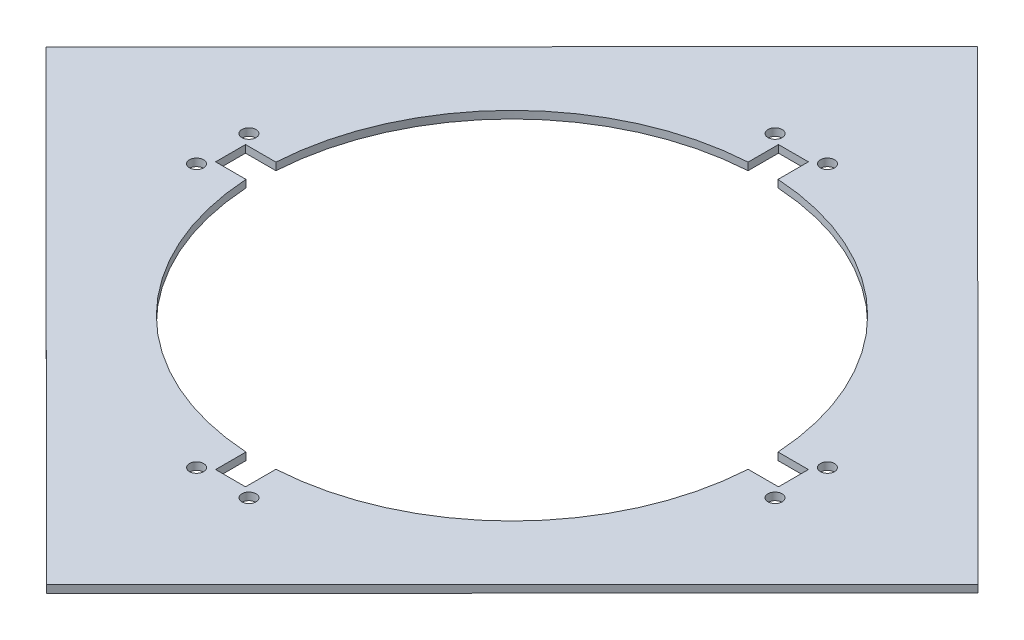
ISO-10303-21;
HEADER;
FILE_DESCRIPTION(('STEP AP214'),'2;1');
FILE_NAME('part.step','',(''),(''),'','','');
FILE_SCHEMA(('AUTOMOTIVE_DESIGN { 1 0 10303 214 1 1 1 1 }'));
ENDSEC;
DATA;
#1=APPLICATION_CONTEXT('core data for automotive mechanical design processes');
#2=APPLICATION_PROTOCOL_DEFINITION('international standard','automotive_design',2000,#1);
#3=PRODUCT_CONTEXT('',#1,'mechanical');
#4=PRODUCT('Part','Part','',(#3));
#5=PRODUCT_RELATED_PRODUCT_CATEGORY('part','',(#4));
#6=PRODUCT_DEFINITION_FORMATION('','',#4);
#7=PRODUCT_DEFINITION_CONTEXT('part definition',#1,'design');
#8=PRODUCT_DEFINITION('design','',#6,#7);
#9=PRODUCT_DEFINITION_SHAPE('','',#8);
#10=(LENGTH_UNIT() NAMED_UNIT(*) SI_UNIT(.MILLI.,.METRE.));
#11=(NAMED_UNIT(*) PLANE_ANGLE_UNIT() SI_UNIT($,.RADIAN.));
#12=(NAMED_UNIT(*) SI_UNIT($,.STERADIAN.) SOLID_ANGLE_UNIT());
#13=UNCERTAINTY_MEASURE_WITH_UNIT(LENGTH_MEASURE(1.E-05),#10,'distance_accuracy_value','');
#14=(GEOMETRIC_REPRESENTATION_CONTEXT(3) GLOBAL_UNCERTAINTY_ASSIGNED_CONTEXT((#13)) GLOBAL_UNIT_ASSIGNED_CONTEXT((#10,
#11,#12)) REPRESENTATION_CONTEXT('',''));
#15=CARTESIAN_POINT('',(0.,0.,0.));
#16=DIRECTION('',(0.,0.,1.));
#17=DIRECTION('',(1.,0.,0.));
#18=AXIS2_PLACEMENT_3D('',#15,#16,#17);
#19=CARTESIAN_POINT('',(0.,1.5875,0.));
#20=DIRECTION('',(0.,-1.,0.));
#21=DIRECTION('',(0.,0.,-1.));
#22=AXIS2_PLACEMENT_3D('',#19,#20,#21);
#23=CYLINDRICAL_SURFACE('',#22,53.34);
#24=DIRECTION('',(0.,-1.,0.));
#25=VECTOR('',#24,1.);
#26=CARTESIAN_POINT('',(-3.175,1.5875,-53.2454221036889));
#27=LINE('',#26,#25);
#28=CARTESIAN_POINT('',(-3.175,1.5875,-53.2454221036889));
#29=VERTEX_POINT('',#28);
#30=CARTESIAN_POINT('',(-3.175,0.,-53.2454221036889));
#31=VERTEX_POINT('',#30);
#32=EDGE_CURVE('E184',#29,#31,#27,.T.);
#33=ORIENTED_EDGE('',*,*,#32,.F.);
#34=CARTESIAN_POINT('',(0.,1.5875,0.));
#35=DIRECTION('',(0.,1.,0.));
#36=DIRECTION('',(0.,0.,1.));
#37=AXIS2_PLACEMENT_3D('',#34,#35,#36);
#38=CIRCLE('',#37,53.34);
#39=CARTESIAN_POINT('',(-53.245422103689,1.5875,-3.17499999999861));
#40=VERTEX_POINT('',#39);
#41=EDGE_CURVE('E698',#29,#40,#38,.T.);
#42=ORIENTED_EDGE('',*,*,#41,.T.);
#43=DIRECTION('',(0.,-1.,0.));
#44=VECTOR('',#43,1.);
#45=CARTESIAN_POINT('',(-53.245422103689,1.5875,-3.17499999999861));
#46=LINE('',#45,#44);
#47=CARTESIAN_POINT('',(-53.245422103689,0.,-3.17499999999861));
#48=VERTEX_POINT('',#47);
#49=EDGE_CURVE('E177',#48,#40,#46,.F.);
#50=ORIENTED_EDGE('',*,*,#49,.F.);
#51=CARTESIAN_POINT('',(0.,0.,0.));
#52=DIRECTION('',(0.,1.,0.));
#53=DIRECTION('',(0.,0.,1.));
#54=AXIS2_PLACEMENT_3D('',#51,#52,#53);
#55=CIRCLE('',#54,53.34);
#56=EDGE_CURVE('E387',#31,#48,#55,.T.);
#57=ORIENTED_EDGE('',*,*,#56,.F.);
#58=EDGE_LOOP('',(#33,#42,#50,#57));
#59=FACE_BOUND('',#58,.T.);
#60=ADVANCED_FACE('F33',(#59),#23,.F.);
#61=DIRECTION('',(0.,-1.,0.));
#62=VECTOR('',#61,1.);
#63=CARTESIAN_POINT('',(3.175,1.5875,-53.2454221036889));
#64=LINE('',#63,#62);
#65=CARTESIAN_POINT('',(3.175,0.,-53.2454221036889));
#66=VERTEX_POINT('',#65);
#67=CARTESIAN_POINT('',(3.175,1.5875,-53.2454221036889));
#68=VERTEX_POINT('',#67);
#69=EDGE_CURVE('E262',#66,#68,#64,.F.);
#70=ORIENTED_EDGE('',*,*,#69,.F.);
#71=CARTESIAN_POINT('',(53.2454221036889,0.,-3.17499999999981));
#72=VERTEX_POINT('',#71);
#73=EDGE_CURVE('E328',#72,#66,#55,.T.);
#74=ORIENTED_EDGE('',*,*,#73,.F.);
#75=DIRECTION('',(0.,-1.,0.));
#76=VECTOR('',#75,1.);
#77=CARTESIAN_POINT('',(53.2454221036889,1.5875,-3.17499999999981));
#78=LINE('',#77,#76);
#79=CARTESIAN_POINT('',(53.2454221036889,1.5875,-3.17499999999981));
#80=VERTEX_POINT('',#79);
#81=EDGE_CURVE('E260',#80,#72,#78,.T.);
#82=ORIENTED_EDGE('',*,*,#81,.F.);
#83=EDGE_CURVE('E288',#80,#68,#38,.T.);
#84=ORIENTED_EDGE('',*,*,#83,.T.);
#85=EDGE_LOOP('',(#70,#74,#82,#84));
#86=FACE_BOUND('',#85,.T.);
#87=ADVANCED_FACE('F386',(#86),#23,.F.);
#88=DIRECTION('',(0.,-1.,0.));
#89=VECTOR('',#88,1.);
#90=CARTESIAN_POINT('',(53.2454221036889,1.5875,3.17500000000019));
#91=LINE('',#90,#89);
#92=CARTESIAN_POINT('',(53.2454221036889,0.,3.17500000000019));
#93=VERTEX_POINT('',#92);
#94=CARTESIAN_POINT('',(53.2454221036889,1.5875,3.17500000000019));
#95=VERTEX_POINT('',#94);
#96=EDGE_CURVE('E258',#93,#95,#91,.F.);
#97=ORIENTED_EDGE('',*,*,#96,.F.);
#98=CARTESIAN_POINT('',(3.1750000000012,0.,53.2454221036888));
#99=VERTEX_POINT('',#98);
#100=EDGE_CURVE('E324',#99,#93,#55,.T.);
#101=ORIENTED_EDGE('',*,*,#100,.F.);
#102=DIRECTION('',(0.,-1.,0.));
#103=VECTOR('',#102,1.);
#104=CARTESIAN_POINT('',(3.1750000000012,1.5875,53.2454221036888));
#105=LINE('',#104,#103);
#106=CARTESIAN_POINT('',(3.1750000000012,1.5875,53.2454221036888));
#107=VERTEX_POINT('',#106);
#108=EDGE_CURVE('E256',#107,#99,#105,.T.);
#109=ORIENTED_EDGE('',*,*,#108,.F.);
#110=EDGE_CURVE('E284',#107,#95,#38,.T.);
#111=ORIENTED_EDGE('',*,*,#110,.T.);
#112=EDGE_LOOP('',(#97,#101,#109,#111));
#113=FACE_BOUND('',#112,.T.);
#114=ADVANCED_FACE('F365',(#113),#23,.F.);
#115=CARTESIAN_POINT('',(-49.3679005560341,1.5875,49.4149055922353));
#116=DIRECTION('',(-0.706770229864482,0.,0.707443172401365));
#117=DIRECTION('',(0.707443172401365,0.,0.706770229864482));
#118=AXIS2_PLACEMENT_3D('',#115,#116,#117);
#119=PLANE('',#118);
#120=DIRECTION('',(-0.707443172401365,0.,-0.706770229864482));
#121=VECTOR('',#120,1.);
#122=CARTESIAN_POINT('',(-49.3679005560341,0.,49.4149055922353));
#123=LINE('',#122,#121);
#124=CARTESIAN_POINT('',(0.04700503620126,0.,98.7828061482694));
#125=VERTEX_POINT('',#124);
#126=CARTESIAN_POINT('',(-98.7828061482694,0.,0.0470050362012461));
#127=VERTEX_POINT('',#126);
#128=EDGE_CURVE('E265',#125,#127,#123,.T.);
#129=ORIENTED_EDGE('',*,*,#128,.F.);
#130=DIRECTION('',(0.,-1.,0.));
#131=VECTOR('',#130,1.);
#132=CARTESIAN_POINT('',(0.04700503620126,1.5875,98.7828061482694));
#133=LINE('',#132,#131);
#134=CARTESIAN_POINT('',(0.04700503620126,1.5875,98.7828061482694));
#135=VERTEX_POINT('',#134);
#136=EDGE_CURVE('E351',#135,#125,#133,.T.);
#137=ORIENTED_EDGE('',*,*,#136,.F.);
#138=DIRECTION('',(-0.707443172401365,0.,-0.706770229864482));
#139=VECTOR('',#138,1.);
#140=CARTESIAN_POINT('',(-49.3679005560341,1.5875,49.4149055922353));
#141=LINE('',#140,#139);
#142=CARTESIAN_POINT('',(-98.7828061482694,1.5875,0.0470050362012461));
#143=VERTEX_POINT('',#142);
#144=EDGE_CURVE('E266',#135,#143,#141,.T.);
#145=ORIENTED_EDGE('',*,*,#144,.T.);
#146=DIRECTION('',(0.,-1.,0.));
#147=VECTOR('',#146,1.);
#148=CARTESIAN_POINT('',(-98.7828061482694,1.5875,0.0470050362012461));
#149=LINE('',#148,#147);
#150=EDGE_CURVE('E306',#143,#127,#149,.T.);
#151=ORIENTED_EDGE('',*,*,#150,.T.);
#152=EDGE_LOOP('',(#129,#137,#145,#151));
#153=FACE_BOUND('',#152,.T.);
#154=ADVANCED_FACE('F35',(#153),#119,.T.);
#155=CARTESIAN_POINT('',(49.4149055922353,1.5875,49.3679005560341));
#156=DIRECTION('',(-0.707443172401365,0.,-0.706770229864482));
#157=DIRECTION('',(-0.706770229864482,0.,0.707443172401365));
#158=AXIS2_PLACEMENT_3D('',#155,#156,#157);
#159=PLANE('',#158);
#160=DIRECTION('',(0.706770229864482,0.,-0.707443172401365));
#161=VECTOR('',#160,1.);
#162=CARTESIAN_POINT('',(49.4149055922353,0.,49.3679005560341));
#163=LINE('',#162,#161);
#164=CARTESIAN_POINT('',(98.7828061482694,0.,-0.0470050362012392));
#165=VERTEX_POINT('',#164);
#166=EDGE_CURVE('E309',#125,#165,#163,.T.);
#167=ORIENTED_EDGE('',*,*,#166,.T.);
#168=DIRECTION('',(0.,-1.,0.));
#169=VECTOR('',#168,1.);
#170=CARTESIAN_POINT('',(98.7828061482694,1.5875,-0.0470050362012392));
#171=LINE('',#170,#169);
#172=CARTESIAN_POINT('',(98.7828061482694,1.5875,-0.0470050362012392));
#173=VERTEX_POINT('',#172);
#174=EDGE_CURVE('E348',#173,#165,#171,.T.);
#175=ORIENTED_EDGE('',*,*,#174,.F.);
#176=DIRECTION('',(0.706770229864482,0.,-0.707443172401365));
#177=VECTOR('',#176,1.);
#178=CARTESIAN_POINT('',(49.4149055922353,1.5875,49.3679005560341));
#179=LINE('',#178,#177);
#180=EDGE_CURVE('E269',#135,#173,#179,.T.);
#181=ORIENTED_EDGE('',*,*,#180,.F.);
#182=ORIENTED_EDGE('',*,*,#136,.T.);
#183=EDGE_LOOP('',(#167,#175,#181,#182));
#184=FACE_BOUND('',#183,.T.);
#185=ADVANCED_FACE('F442',(#184),#159,.F.);
#186=CARTESIAN_POINT('',(49.3679005560341,1.5875,-49.4149055922353));
#187=DIRECTION('',(-0.706770229864482,0.,0.707443172401365));
#188=DIRECTION('',(0.707443172401365,0.,0.706770229864482));
#189=AXIS2_PLACEMENT_3D('',#186,#187,#188);
#190=PLANE('',#189);
#191=DIRECTION('',(-0.707443172401365,0.,-0.706770229864482));
#192=VECTOR('',#191,1.);
#193=CARTESIAN_POINT('',(49.3679005560341,0.,-49.4149055922353));
#194=LINE('',#193,#192);
#195=CARTESIAN_POINT('',(-0.0470050362012461,0.,-98.7828061482694));
#196=VERTEX_POINT('',#195);
#197=EDGE_CURVE('E311',#165,#196,#194,.T.);
#198=ORIENTED_EDGE('',*,*,#197,.T.);
#199=DIRECTION('',(0.,-1.,0.));
#200=VECTOR('',#199,1.);
#201=CARTESIAN_POINT('',(-0.0470050362012461,1.5875,-98.7828061482694));
#202=LINE('',#201,#200);
#203=CARTESIAN_POINT('',(-0.0470050362012461,1.5875,-98.7828061482694));
#204=VERTEX_POINT('',#203);
#205=EDGE_CURVE('E346',#204,#196,#202,.T.);
#206=ORIENTED_EDGE('',*,*,#205,.F.);
#207=DIRECTION('',(-0.707443172401365,0.,-0.706770229864482));
#208=VECTOR('',#207,1.);
#209=CARTESIAN_POINT('',(49.3679005560341,1.5875,-49.4149055922353));
#210=LINE('',#209,#208);
#211=EDGE_CURVE('E272',#173,#204,#210,.T.);
#212=ORIENTED_EDGE('',*,*,#211,.F.);
#213=ORIENTED_EDGE('',*,*,#174,.T.);
#214=EDGE_LOOP('',(#198,#206,#212,#213));
#215=FACE_BOUND('',#214,.T.);
#216=ADVANCED_FACE('F447',(#215),#190,.F.);
#217=CARTESIAN_POINT('',(5.55625,1.5875,61.346730494));
#218=DIRECTION('',(0.,-1.,0.));
#219=DIRECTION('',(0.,0.,-1.));
#220=AXIS2_PLACEMENT_3D('',#217,#218,#219);
#221=CYLINDRICAL_SURFACE('',#220,1.5);
#222=CARTESIAN_POINT('',(5.55625,1.5875,61.346730494));
#223=DIRECTION('',(0.,1.,0.));
#224=DIRECTION('',(0.,0.,1.));
#225=AXIS2_PLACEMENT_3D('',#222,#223,#224);
#226=CIRCLE('',#225,1.5);
#227=CARTESIAN_POINT('',(5.55625,1.5875,62.846730494));
#228=VERTEX_POINT('',#227);
#229=EDGE_CURVE('E300',#228,#228,#226,.T.);
#230=ORIENTED_EDGE('',*,*,#229,.T.);
#231=EDGE_LOOP('',(#230));
#232=FACE_BOUND('',#231,.T.);
#233=CARTESIAN_POINT('',(5.55625,0.,61.346730494));
#234=DIRECTION('',(0.,1.,0.));
#235=DIRECTION('',(0.,0.,1.));
#236=AXIS2_PLACEMENT_3D('',#233,#234,#235);
#237=CIRCLE('',#236,1.5);
#238=CARTESIAN_POINT('',(5.55625,0.,62.846730494));
#239=VERTEX_POINT('',#238);
#240=EDGE_CURVE('E340',#239,#239,#237,.T.);
#241=ORIENTED_EDGE('',*,*,#240,.F.);
#242=EDGE_LOOP('',(#241));
#243=FACE_BOUND('',#242,.T.);
#244=ADVANCED_FACE('F498',(#232,#243),#221,.F.);
#245=CARTESIAN_POINT('',(61.346730494,1.5875,5.55625));
#246=DIRECTION('',(0.,-1.,0.));
#247=DIRECTION('',(0.,0.,-1.));
#248=AXIS2_PLACEMENT_3D('',#245,#246,#247);
#249=CYLINDRICAL_SURFACE('',#248,1.5);
#250=CARTESIAN_POINT('',(61.346730494,1.5875,5.55625));
#251=DIRECTION('',(0.,1.,0.));
#252=DIRECTION('',(0.,0.,1.));
#253=AXIS2_PLACEMENT_3D('',#250,#251,#252);
#254=CIRCLE('',#253,1.5);
#255=CARTESIAN_POINT('',(61.346730494,1.5875,7.05625));
#256=VERTEX_POINT('',#255);
#257=EDGE_CURVE('E297',#256,#256,#254,.T.);
#258=ORIENTED_EDGE('',*,*,#257,.T.);
#259=EDGE_LOOP('',(#258));
#260=FACE_BOUND('',#259,.T.);
#261=CARTESIAN_POINT('',(61.346730494,0.,5.55625));
#262=DIRECTION('',(0.,1.,0.));
#263=DIRECTION('',(0.,0.,1.));
#264=AXIS2_PLACEMENT_3D('',#261,#262,#263);
#265=CIRCLE('',#264,1.5);
#266=CARTESIAN_POINT('',(61.346730494,0.,7.05625));
#267=VERTEX_POINT('',#266);
#268=EDGE_CURVE('E337',#267,#267,#265,.T.);
#269=ORIENTED_EDGE('',*,*,#268,.F.);
#270=EDGE_LOOP('',(#269));
#271=FACE_BOUND('',#270,.T.);
#272=ADVANCED_FACE('F501',(#260,#271),#249,.F.);
#273=CARTESIAN_POINT('',(61.346730494,1.5875,-5.55625));
#274=DIRECTION('',(0.,-1.,0.));
#275=DIRECTION('',(0.,0.,-1.));
#276=AXIS2_PLACEMENT_3D('',#273,#274,#275);
#277=CYLINDRICAL_SURFACE('',#276,1.5);
#278=CARTESIAN_POINT('',(61.346730494,1.5875,-5.55625));
#279=DIRECTION('',(0.,1.,0.));
#280=DIRECTION('',(0.,0.,1.));
#281=AXIS2_PLACEMENT_3D('',#278,#279,#280);
#282=CIRCLE('',#281,1.5);
#283=CARTESIAN_POINT('',(61.346730494,1.5875,-4.05625));
#284=VERTEX_POINT('',#283);
#285=EDGE_CURVE('E294',#284,#284,#282,.T.);
#286=ORIENTED_EDGE('',*,*,#285,.T.);
#287=EDGE_LOOP('',(#286));
#288=FACE_BOUND('',#287,.T.);
#289=CARTESIAN_POINT('',(61.346730494,0.,-5.55625));
#290=DIRECTION('',(0.,1.,0.));
#291=DIRECTION('',(0.,0.,1.));
#292=AXIS2_PLACEMENT_3D('',#289,#290,#291);
#293=CIRCLE('',#292,1.5);
#294=CARTESIAN_POINT('',(61.346730494,0.,-4.05625));
#295=VERTEX_POINT('',#294);
#296=EDGE_CURVE('E334',#295,#295,#293,.T.);
#297=ORIENTED_EDGE('',*,*,#296,.F.);
#298=EDGE_LOOP('',(#297));
#299=FACE_BOUND('',#298,.T.);
#300=ADVANCED_FACE('F505',(#288,#299),#277,.F.);
#301=CARTESIAN_POINT('',(-61.346730494,1.5875,-5.55625));
#302=DIRECTION('',(0.,-1.,0.));
#303=DIRECTION('',(0.,0.,-1.));
#304=AXIS2_PLACEMENT_3D('',#301,#302,#303);
#305=CYLINDRICAL_SURFACE('',#304,1.5);
#306=CARTESIAN_POINT('',(-61.346730494,1.5875,-5.55625));
#307=DIRECTION('',(0.,1.,0.));
#308=DIRECTION('',(0.,0.,1.));
#309=AXIS2_PLACEMENT_3D('',#306,#307,#308);
#310=CIRCLE('',#309,1.5);
#311=CARTESIAN_POINT('',(-61.346730494,1.5875,-4.05625));
#312=VERTEX_POINT('',#311);
#313=EDGE_CURVE('E291',#312,#312,#310,.T.);
#314=ORIENTED_EDGE('',*,*,#313,.T.);
#315=EDGE_LOOP('',(#314));
#316=FACE_BOUND('',#315,.T.);
#317=CARTESIAN_POINT('',(-61.346730494,0.,-5.55625));
#318=DIRECTION('',(0.,1.,0.));
#319=DIRECTION('',(0.,0.,1.));
#320=AXIS2_PLACEMENT_3D('',#317,#318,#319);
#321=CIRCLE('',#320,1.5);
#322=CARTESIAN_POINT('',(-61.346730494,0.,-4.05625));
#323=VERTEX_POINT('',#322);
#324=EDGE_CURVE('E331',#323,#323,#321,.T.);
#325=ORIENTED_EDGE('',*,*,#324,.F.);
#326=EDGE_LOOP('',(#325));
#327=FACE_BOUND('',#326,.T.);
#328=ADVANCED_FACE('F436',(#316,#327),#305,.F.);
#329=CARTESIAN_POINT('',(-61.346730494,1.5875,5.55625));
#330=DIRECTION('',(0.,-1.,0.));
#331=DIRECTION('',(0.,0.,-1.));
#332=AXIS2_PLACEMENT_3D('',#329,#330,#331);
#333=CYLINDRICAL_SURFACE('',#332,1.5);
#334=CARTESIAN_POINT('',(-61.346730494,1.5875,5.55625));
#335=DIRECTION('',(0.,1.,0.));
#336=DIRECTION('',(0.,0.,1.));
#337=AXIS2_PLACEMENT_3D('',#334,#335,#336);
#338=CIRCLE('',#337,1.5);
#339=CARTESIAN_POINT('',(-61.346730494,1.5875,7.05625));
#340=VERTEX_POINT('',#339);
#341=EDGE_CURVE('E287',#340,#340,#338,.T.);
#342=ORIENTED_EDGE('',*,*,#341,.T.);
#343=EDGE_LOOP('',(#342));
#344=FACE_BOUND('',#343,.T.);
#345=CARTESIAN_POINT('',(-61.346730494,0.,5.55625));
#346=DIRECTION('',(0.,1.,0.));
#347=DIRECTION('',(0.,0.,1.));
#348=AXIS2_PLACEMENT_3D('',#345,#346,#347);
#349=CIRCLE('',#348,1.5);
#350=CARTESIAN_POINT('',(-61.346730494,0.,7.05625));
#351=VERTEX_POINT('',#350);
#352=EDGE_CURVE('E327',#351,#351,#349,.T.);
#353=ORIENTED_EDGE('',*,*,#352,.F.);
#354=EDGE_LOOP('',(#353));
#355=FACE_BOUND('',#354,.T.);
#356=ADVANCED_FACE('F429',(#344,#355),#333,.F.);
#357=DIRECTION('',(0.,-1.,0.));
#358=VECTOR('',#357,1.);
#359=CARTESIAN_POINT('',(-3.1749999999988,1.5875,53.2454221036889));
#360=LINE('',#359,#358);
#361=CARTESIAN_POINT('',(-3.1749999999988,0.,53.2454221036889));
#362=VERTEX_POINT('',#361);
#363=CARTESIAN_POINT('',(-3.1749999999988,1.5875,53.2454221036889));
#364=VERTEX_POINT('',#363);
#365=EDGE_CURVE('E254',#362,#364,#360,.F.);
#366=ORIENTED_EDGE('',*,*,#365,.F.);
#367=CARTESIAN_POINT('',(-53.2454221036888,0.,3.17500000000139));
#368=VERTEX_POINT('',#367);
#369=EDGE_CURVE('E323',#368,#362,#55,.T.);
#370=ORIENTED_EDGE('',*,*,#369,.F.);
#371=DIRECTION('',(0.,-1.,0.));
#372=VECTOR('',#371,1.);
#373=CARTESIAN_POINT('',(-53.2454221036888,1.5875,3.17500000000139));
#374=LINE('',#373,#372);
#375=CARTESIAN_POINT('',(-53.2454221036888,1.5875,3.17500000000139));
#376=VERTEX_POINT('',#375);
#377=EDGE_CURVE('E252',#376,#368,#374,.T.);
#378=ORIENTED_EDGE('',*,*,#377,.F.);
#379=EDGE_CURVE('E283',#376,#364,#38,.T.);
#380=ORIENTED_EDGE('',*,*,#379,.T.);
#381=EDGE_LOOP('',(#366,#370,#378,#380));
#382=FACE_BOUND('',#381,.T.);
#383=ADVANCED_FACE('F394',(#382),#23,.F.);
#384=CARTESIAN_POINT('',(5.55625,1.5875,-61.346730494));
#385=DIRECTION('',(0.,-1.,0.));
#386=DIRECTION('',(0.,0.,-1.));
#387=AXIS2_PLACEMENT_3D('',#384,#385,#386);
#388=CYLINDRICAL_SURFACE('',#387,1.5);
#389=CARTESIAN_POINT('',(5.55625,1.5875,-61.346730494));
#390=DIRECTION('',(0.,1.,0.));
#391=DIRECTION('',(0.,0.,1.));
#392=AXIS2_PLACEMENT_3D('',#389,#390,#391);
#393=CIRCLE('',#392,1.5);
#394=CARTESIAN_POINT('',(5.55625,1.5875,-59.846730494));
#395=VERTEX_POINT('',#394);
#396=EDGE_CURVE('E280',#395,#395,#393,.T.);
#397=ORIENTED_EDGE('',*,*,#396,.T.);
#398=EDGE_LOOP('',(#397));
#399=FACE_BOUND('',#398,.T.);
#400=CARTESIAN_POINT('',(5.55625,0.,-61.346730494));
#401=DIRECTION('',(0.,1.,0.));
#402=DIRECTION('',(0.,0.,1.));
#403=AXIS2_PLACEMENT_3D('',#400,#401,#402);
#404=CIRCLE('',#403,1.5);
#405=CARTESIAN_POINT('',(5.55625,0.,-59.846730494));
#406=VERTEX_POINT('',#405);
#407=EDGE_CURVE('E320',#406,#406,#404,.T.);
#408=ORIENTED_EDGE('',*,*,#407,.F.);
#409=EDGE_LOOP('',(#408));
#410=FACE_BOUND('',#409,.T.);
#411=ADVANCED_FACE('F428',(#399,#410),#388,.F.);
#412=CARTESIAN_POINT('',(-5.55625,1.5875,-61.346730494));
#413=DIRECTION('',(0.,-1.,0.));
#414=DIRECTION('',(0.,0.,-1.));
#415=AXIS2_PLACEMENT_3D('',#412,#413,#414);
#416=CYLINDRICAL_SURFACE('',#415,1.5);
#417=CARTESIAN_POINT('',(-5.55625,1.5875,-61.346730494));
#418=DIRECTION('',(0.,1.,0.));
#419=DIRECTION('',(0.,0.,1.));
#420=AXIS2_PLACEMENT_3D('',#417,#418,#419);
#421=CIRCLE('',#420,1.5);
#422=CARTESIAN_POINT('',(-5.55625,1.5875,-59.846730494));
#423=VERTEX_POINT('',#422);
#424=EDGE_CURVE('E277',#423,#423,#421,.T.);
#425=ORIENTED_EDGE('',*,*,#424,.T.);
#426=EDGE_LOOP('',(#425));
#427=FACE_BOUND('',#426,.T.);
#428=CARTESIAN_POINT('',(-5.55625,0.,-61.346730494));
#429=DIRECTION('',(0.,1.,0.));
#430=DIRECTION('',(0.,0.,1.));
#431=AXIS2_PLACEMENT_3D('',#428,#429,#430);
#432=CIRCLE('',#431,1.5);
#433=CARTESIAN_POINT('',(-5.55625,0.,-59.846730494));
#434=VERTEX_POINT('',#433);
#435=EDGE_CURVE('E317',#434,#434,#432,.T.);
#436=ORIENTED_EDGE('',*,*,#435,.F.);
#437=EDGE_LOOP('',(#436));
#438=FACE_BOUND('',#437,.T.);
#439=ADVANCED_FACE('F434',(#427,#438),#416,.F.);
#440=CARTESIAN_POINT('',(-49.4149055922353,1.5875,-49.3679005560341));
#441=DIRECTION('',(-0.707443172401365,0.,-0.706770229864482));
#442=DIRECTION('',(-0.706770229864482,0.,0.707443172401365));
#443=AXIS2_PLACEMENT_3D('',#440,#441,#442);
#444=PLANE('',#443);
#445=DIRECTION('',(0.706770229864482,0.,-0.707443172401365));
#446=VECTOR('',#445,1.);
#447=CARTESIAN_POINT('',(-49.4149055922353,0.,-49.3679005560341));
#448=LINE('',#447,#446);
#449=EDGE_CURVE('E314',#127,#196,#448,.T.);
#450=ORIENTED_EDGE('',*,*,#449,.F.);
#451=ORIENTED_EDGE('',*,*,#150,.F.);
#452=DIRECTION('',(0.706770229864482,0.,-0.707443172401365));
#453=VECTOR('',#452,1.);
#454=CARTESIAN_POINT('',(-49.4149055922353,1.5875,-49.3679005560341));
#455=LINE('',#454,#453);
#456=EDGE_CURVE('E274',#143,#204,#455,.T.);
#457=ORIENTED_EDGE('',*,*,#456,.T.);
#458=ORIENTED_EDGE('',*,*,#205,.T.);
#459=EDGE_LOOP('',(#450,#451,#457,#458));
#460=FACE_BOUND('',#459,.T.);
#461=ADVANCED_FACE('F457',(#460),#444,.T.);
#462=CARTESIAN_POINT('',(-5.55625,1.5875,61.346730494));
#463=DIRECTION('',(0.,-1.,0.));
#464=DIRECTION('',(0.,0.,-1.));
#465=AXIS2_PLACEMENT_3D('',#462,#463,#464);
#466=CYLINDRICAL_SURFACE('',#465,1.5);
#467=CARTESIAN_POINT('',(-5.55625,1.5875,61.346730494));
#468=DIRECTION('',(0.,1.,0.));
#469=DIRECTION('',(0.,0.,1.));
#470=AXIS2_PLACEMENT_3D('',#467,#468,#469);
#471=CIRCLE('',#470,1.5);
#472=CARTESIAN_POINT('',(-5.55625,1.5875,62.846730494));
#473=VERTEX_POINT('',#472);
#474=EDGE_CURVE('E303',#473,#473,#471,.T.);
#475=ORIENTED_EDGE('',*,*,#474,.T.);
#476=EDGE_LOOP('',(#475));
#477=FACE_BOUND('',#476,.T.);
#478=CARTESIAN_POINT('',(-5.55625,0.,61.346730494));
#479=DIRECTION('',(0.,1.,0.));
#480=DIRECTION('',(0.,0.,1.));
#481=AXIS2_PLACEMENT_3D('',#478,#479,#480);
#482=CIRCLE('',#481,1.5);
#483=CARTESIAN_POINT('',(-5.55625,0.,62.846730494));
#484=VERTEX_POINT('',#483);
#485=EDGE_CURVE('E270',#484,#484,#482,.T.);
#486=ORIENTED_EDGE('',*,*,#485,.F.);
#487=EDGE_LOOP('',(#486));
#488=FACE_BOUND('',#487,.T.);
#489=ADVANCED_FACE('F466',(#477,#488),#466,.F.);
#490=CARTESIAN_POINT('',(0.,1.5875,0.));
#491=DIRECTION('',(0.,1.,0.));
#492=DIRECTION('',(0.,0.,1.));
#493=AXIS2_PLACEMENT_3D('',#490,#491,#492);
#494=PLANE('',#493);
#495=DIRECTION('',(0.,0.,1.));
#496=VECTOR('',#495,1.);
#497=CARTESIAN_POINT('',(-3.175,1.5875,-53.34));
#498=LINE('',#497,#496);
#499=CARTESIAN_POINT('',(-3.175,1.5875,-59.69));
#500=VERTEX_POINT('',#499);
#501=EDGE_CURVE('E192',#500,#29,#498,.T.);
#502=ORIENTED_EDGE('',*,*,#501,.F.);
#503=DIRECTION('',(-1.,0.,0.));
#504=VECTOR('',#503,1.);
#505=CARTESIAN_POINT('',(3.175,1.5875,-59.69));
#506=LINE('',#505,#504);
#507=CARTESIAN_POINT('',(3.175,1.5875,-59.69));
#508=VERTEX_POINT('',#507);
#509=EDGE_CURVE('E174',#508,#500,#506,.T.);
#510=ORIENTED_EDGE('',*,*,#509,.F.);
#511=DIRECTION('',(0.,0.,-1.));
#512=VECTOR('',#511,1.);
#513=CARTESIAN_POINT('',(3.175,1.5875,-53.34));
#514=LINE('',#513,#512);
#515=EDGE_CURVE('E196',#68,#508,#514,.T.);
#516=ORIENTED_EDGE('',*,*,#515,.F.);
#517=ORIENTED_EDGE('',*,*,#83,.F.);
#518=DIRECTION('',(-1.,0.,0.));
#519=VECTOR('',#518,1.);
#520=CARTESIAN_POINT('',(53.3400000000014,1.5875,-3.17499999999981));
#521=LINE('',#520,#519);
#522=CARTESIAN_POINT('',(59.6900000000014,1.5875,-3.17499999999981));
#523=VERTEX_POINT('',#522);
#524=EDGE_CURVE('E203',#523,#80,#521,.T.);
#525=ORIENTED_EDGE('',*,*,#524,.F.);
#526=DIRECTION('',(0.,0.,-1.));
#527=VECTOR('',#526,1.);
#528=CARTESIAN_POINT('',(59.6900000000014,1.5875,3.17500000000019));
#529=LINE('',#528,#527);
#530=CARTESIAN_POINT('',(59.6900000000014,1.5875,3.17500000000019));
#531=VERTEX_POINT('',#530);
#532=EDGE_CURVE('E209',#531,#523,#529,.T.);
#533=ORIENTED_EDGE('',*,*,#532,.F.);
#534=DIRECTION('',(1.,0.,0.));
#535=VECTOR('',#534,1.);
#536=CARTESIAN_POINT('',(53.3400000000014,1.5875,3.17500000000019));
#537=LINE('',#536,#535);
#538=EDGE_CURVE('E207',#95,#531,#537,.T.);
#539=ORIENTED_EDGE('',*,*,#538,.F.);
#540=ORIENTED_EDGE('',*,*,#110,.F.);
#541=DIRECTION('',(0.,0.,-1.));
#542=VECTOR('',#541,1.);
#543=CARTESIAN_POINT('',(3.1750000000012,1.5875,53.3400000000016));
#544=LINE('',#543,#542);
#545=CARTESIAN_POINT('',(3.1750000000012,1.5875,59.6900000000016));
#546=VERTEX_POINT('',#545);
#547=EDGE_CURVE('E220',#546,#107,#544,.T.);
#548=ORIENTED_EDGE('',*,*,#547,.F.);
#549=DIRECTION('',(1.,0.,0.));
#550=VECTOR('',#549,1.);
#551=CARTESIAN_POINT('',(-3.1749999999988,1.5875,59.6900000000016));
#552=LINE('',#551,#550);
#553=CARTESIAN_POINT('',(-3.1749999999988,1.5875,59.6900000000016));
#554=VERTEX_POINT('',#553);
#555=EDGE_CURVE('E226',#554,#546,#552,.T.);
#556=ORIENTED_EDGE('',*,*,#555,.F.);
#557=DIRECTION('',(0.,0.,1.));
#558=VECTOR('',#557,1.);
#559=CARTESIAN_POINT('',(-3.1749999999988,1.5875,53.3400000000016));
#560=LINE('',#559,#558);
#561=EDGE_CURVE('E224',#364,#554,#560,.T.);
#562=ORIENTED_EDGE('',*,*,#561,.F.);
#563=ORIENTED_EDGE('',*,*,#379,.F.);
#564=DIRECTION('',(1.,0.,0.));
#565=VECTOR('',#564,1.);
#566=CARTESIAN_POINT('',(-53.3400000000002,1.5875,3.17500000000139));
#567=LINE('',#566,#565);
#568=CARTESIAN_POINT('',(-59.6900000000002,1.5875,3.1750000000014));
#569=VERTEX_POINT('',#568);
#570=EDGE_CURVE('E238',#569,#376,#567,.T.);
#571=ORIENTED_EDGE('',*,*,#570,.F.);
#572=DIRECTION('',(0.,0.,1.));
#573=VECTOR('',#572,1.);
#574=CARTESIAN_POINT('',(-59.6900000000002,1.5875,-3.1749999999986));
#575=LINE('',#574,#573);
#576=CARTESIAN_POINT('',(-59.6900000000002,1.5875,-3.1749999999986));
#577=VERTEX_POINT('',#576);
#578=EDGE_CURVE('E244',#577,#569,#575,.T.);
#579=ORIENTED_EDGE('',*,*,#578,.F.);
#580=DIRECTION('',(-1.,0.,0.));
#581=VECTOR('',#580,1.);
#582=CARTESIAN_POINT('',(-53.3400000000002,1.5875,-3.17499999999861));
#583=LINE('',#582,#581);
#584=EDGE_CURVE('E242',#40,#577,#583,.T.);
#585=ORIENTED_EDGE('',*,*,#584,.F.);
#586=ORIENTED_EDGE('',*,*,#41,.F.);
#587=EDGE_LOOP('',(#502,#510,#516,#517,#525,#533,#539,#540,#548,#556,#562,#563,#571,#579,#585,#586));
#588=FACE_BOUND('',#587,.T.);
#589=ORIENTED_EDGE('',*,*,#144,.F.);
#590=ORIENTED_EDGE('',*,*,#180,.T.);
#591=ORIENTED_EDGE('',*,*,#211,.T.);
#592=ORIENTED_EDGE('',*,*,#456,.F.);
#593=EDGE_LOOP('',(#589,#590,#591,#592));
#594=FACE_BOUND('',#593,.T.);
#595=ORIENTED_EDGE('',*,*,#424,.F.);
#596=EDGE_LOOP('',(#595));
#597=FACE_BOUND('',#596,.T.);
#598=ORIENTED_EDGE('',*,*,#396,.F.);
#599=EDGE_LOOP('',(#598));
#600=FACE_BOUND('',#599,.T.);
#601=ORIENTED_EDGE('',*,*,#341,.F.);
#602=EDGE_LOOP('',(#601));
#603=FACE_BOUND('',#602,.T.);
#604=ORIENTED_EDGE('',*,*,#313,.F.);
#605=EDGE_LOOP('',(#604));
#606=FACE_BOUND('',#605,.T.);
#607=ORIENTED_EDGE('',*,*,#285,.F.);
#608=EDGE_LOOP('',(#607));
#609=FACE_BOUND('',#608,.T.);
#610=ORIENTED_EDGE('',*,*,#257,.F.);
#611=EDGE_LOOP('',(#610));
#612=FACE_BOUND('',#611,.T.);
#613=ORIENTED_EDGE('',*,*,#229,.F.);
#614=EDGE_LOOP('',(#613));
#615=FACE_BOUND('',#614,.T.);
#616=ORIENTED_EDGE('',*,*,#474,.F.);
#617=EDGE_LOOP('',(#616));
#618=FACE_BOUND('',#617,.T.);
#619=ADVANCED_FACE('F370',(#588,#594,#597,#600,#603,#606,#609,#612,#615,#618),#494,.T.);
#620=CARTESIAN_POINT('',(0.,0.,0.));
#621=DIRECTION('',(0.,1.,0.));
#622=DIRECTION('',(0.,0.,1.));
#623=AXIS2_PLACEMENT_3D('',#620,#621,#622);
#624=PLANE('',#623);
#625=ORIENTED_EDGE('',*,*,#128,.T.);
#626=ORIENTED_EDGE('',*,*,#449,.T.);
#627=ORIENTED_EDGE('',*,*,#197,.F.);
#628=ORIENTED_EDGE('',*,*,#166,.F.);
#629=EDGE_LOOP('',(#625,#626,#627,#628));
#630=FACE_BOUND('',#629,.T.);
#631=ORIENTED_EDGE('',*,*,#435,.T.);
#632=EDGE_LOOP('',(#631));
#633=FACE_BOUND('',#632,.T.);
#634=ORIENTED_EDGE('',*,*,#407,.T.);
#635=EDGE_LOOP('',(#634));
#636=FACE_BOUND('',#635,.T.);
#637=DIRECTION('',(-1.,0.,0.));
#638=VECTOR('',#637,1.);
#639=CARTESIAN_POINT('',(3.175,0.,-59.69));
#640=LINE('',#639,#638);
#641=CARTESIAN_POINT('',(3.175,0.,-59.69));
#642=VERTEX_POINT('',#641);
#643=CARTESIAN_POINT('',(-3.175,0.,-59.69));
#644=VERTEX_POINT('',#643);
#645=EDGE_CURVE('E48',#642,#644,#640,.T.);
#646=ORIENTED_EDGE('',*,*,#645,.T.);
#647=DIRECTION('',(0.,0.,1.));
#648=VECTOR('',#647,1.);
#649=CARTESIAN_POINT('',(-3.175,0.,-59.69));
#650=LINE('',#649,#648);
#651=EDGE_CURVE('E181',#644,#31,#650,.T.);
#652=ORIENTED_EDGE('',*,*,#651,.T.);
#653=ORIENTED_EDGE('',*,*,#56,.T.);
#654=DIRECTION('',(-1.,0.,0.));
#655=VECTOR('',#654,1.);
#656=CARTESIAN_POINT('',(0.,0.,-3.17499999999861));
#657=LINE('',#656,#655);
#658=CARTESIAN_POINT('',(-59.6900000000002,0.,-3.1749999999986));
#659=VERTEX_POINT('',#658);
#660=EDGE_CURVE('E353',#48,#659,#657,.T.);
#661=ORIENTED_EDGE('',*,*,#660,.T.);
#662=DIRECTION('',(0.,0.,1.));
#663=VECTOR('',#662,1.);
#664=CARTESIAN_POINT('',(-59.6900000000002,0.,-3.1749999999986));
#665=LINE('',#664,#663);
#666=CARTESIAN_POINT('',(-59.6900000000002,0.,3.1750000000014));
#667=VERTEX_POINT('',#666);
#668=EDGE_CURVE('E234',#659,#667,#665,.T.);
#669=ORIENTED_EDGE('',*,*,#668,.T.);
#670=DIRECTION('',(1.,0.,0.));
#671=VECTOR('',#670,1.);
#672=CARTESIAN_POINT('',(-59.6900000000002,0.,3.1750000000014));
#673=LINE('',#672,#671);
#674=EDGE_CURVE('E237',#667,#368,#673,.T.);
#675=ORIENTED_EDGE('',*,*,#674,.T.);
#676=ORIENTED_EDGE('',*,*,#369,.T.);
#677=DIRECTION('',(0.,0.,1.));
#678=VECTOR('',#677,1.);
#679=CARTESIAN_POINT('',(-3.17499999999881,0.,0.));
#680=LINE('',#679,#678);
#681=CARTESIAN_POINT('',(-3.1749999999988,0.,59.6900000000016));
#682=VERTEX_POINT('',#681);
#683=EDGE_CURVE('E356',#362,#682,#680,.T.);
#684=ORIENTED_EDGE('',*,*,#683,.T.);
#685=DIRECTION('',(1.,0.,0.));
#686=VECTOR('',#685,1.);
#687=CARTESIAN_POINT('',(-3.1749999999988,0.,59.6900000000016));
#688=LINE('',#687,#686);
#689=CARTESIAN_POINT('',(3.1750000000012,0.,59.6900000000016));
#690=VERTEX_POINT('',#689);
#691=EDGE_CURVE('E216',#682,#690,#688,.T.);
#692=ORIENTED_EDGE('',*,*,#691,.T.);
#693=DIRECTION('',(0.,0.,-1.));
#694=VECTOR('',#693,1.);
#695=CARTESIAN_POINT('',(3.1750000000012,0.,59.6900000000016));
#696=LINE('',#695,#694);
#697=EDGE_CURVE('E219',#690,#99,#696,.T.);
#698=ORIENTED_EDGE('',*,*,#697,.T.);
#699=ORIENTED_EDGE('',*,*,#100,.T.);
#700=DIRECTION('',(1.,0.,0.));
#701=VECTOR('',#700,1.);
#702=CARTESIAN_POINT('',(0.,0.,3.17500000000019));
#703=LINE('',#702,#701);
#704=CARTESIAN_POINT('',(59.6900000000014,0.,3.17500000000019));
#705=VERTEX_POINT('',#704);
#706=EDGE_CURVE('E41',#93,#705,#703,.T.);
#707=ORIENTED_EDGE('',*,*,#706,.T.);
#708=DIRECTION('',(0.,0.,-1.));
#709=VECTOR('',#708,1.);
#710=CARTESIAN_POINT('',(59.6900000000014,0.,3.17500000000019));
#711=LINE('',#710,#709);
#712=CARTESIAN_POINT('',(59.6900000000014,0.,-3.17499999999981));
#713=VERTEX_POINT('',#712);
#714=EDGE_CURVE('E56',#705,#713,#711,.T.);
#715=ORIENTED_EDGE('',*,*,#714,.T.);
#716=DIRECTION('',(-1.,0.,0.));
#717=VECTOR('',#716,1.);
#718=CARTESIAN_POINT('',(59.6900000000014,0.,-3.17499999999981));
#719=LINE('',#718,#717);
#720=EDGE_CURVE('E202',#713,#72,#719,.T.);
#721=ORIENTED_EDGE('',*,*,#720,.T.);
#722=ORIENTED_EDGE('',*,*,#73,.T.);
#723=DIRECTION('',(0.,0.,-1.));
#724=VECTOR('',#723,1.);
#725=CARTESIAN_POINT('',(3.175,0.,0.));
#726=LINE('',#725,#724);
#727=EDGE_CURVE('E11',#66,#642,#726,.T.);
#728=ORIENTED_EDGE('',*,*,#727,.T.);
#729=EDGE_LOOP('',(#646,#652,#653,#661,#669,#675,#676,#684,#692,#698,#699,#707,#715,#721,#722,#728));
#730=FACE_BOUND('',#729,.T.);
#731=ORIENTED_EDGE('',*,*,#352,.T.);
#732=EDGE_LOOP('',(#731));
#733=FACE_BOUND('',#732,.T.);
#734=ORIENTED_EDGE('',*,*,#324,.T.);
#735=EDGE_LOOP('',(#734));
#736=FACE_BOUND('',#735,.T.);
#737=ORIENTED_EDGE('',*,*,#296,.T.);
#738=EDGE_LOOP('',(#737));
#739=FACE_BOUND('',#738,.T.);
#740=ORIENTED_EDGE('',*,*,#268,.T.);
#741=EDGE_LOOP('',(#740));
#742=FACE_BOUND('',#741,.T.);
#743=ORIENTED_EDGE('',*,*,#240,.T.);
#744=EDGE_LOOP('',(#743));
#745=FACE_BOUND('',#744,.T.);
#746=ORIENTED_EDGE('',*,*,#485,.T.);
#747=EDGE_LOOP('',(#746));
#748=FACE_BOUND('',#747,.T.);
#749=ADVANCED_FACE('F189',(#630,#633,#636,#730,#733,#736,#739,#742,#745,#748),#624,.F.);
#750=CARTESIAN_POINT('',(-53.3400000000002,0.,3.17500000000139));
#751=DIRECTION('',(0.,0.,1.));
#752=DIRECTION('',(1.,0.,0.));
#753=AXIS2_PLACEMENT_3D('',#750,#751,#752);
#754=PLANE('',#753);
#755=ORIENTED_EDGE('',*,*,#377,.T.);
#756=ORIENTED_EDGE('',*,*,#674,.F.);
#757=DIRECTION('',(0.,1.,0.));
#758=VECTOR('',#757,1.);
#759=CARTESIAN_POINT('',(-59.6900000000002,0.,3.1750000000014));
#760=LINE('',#759,#758);
#761=EDGE_CURVE('E227',#667,#569,#760,.T.);
#762=ORIENTED_EDGE('',*,*,#761,.T.);
#763=ORIENTED_EDGE('',*,*,#570,.T.);
#764=EDGE_LOOP('',(#755,#756,#762,#763));
#765=FACE_BOUND('',#764,.T.);
#766=ADVANCED_FACE('F490',(#765),#754,.F.);
#767=CARTESIAN_POINT('',(-59.6900000000002,0.,-3.1749999999986));
#768=DIRECTION('',(-1.,0.,0.));
#769=DIRECTION('',(0.,0.,1.));
#770=AXIS2_PLACEMENT_3D('',#767,#768,#769);
#771=PLANE('',#770);
#772=ORIENTED_EDGE('',*,*,#578,.T.);
#773=ORIENTED_EDGE('',*,*,#761,.F.);
#774=ORIENTED_EDGE('',*,*,#668,.F.);
#775=DIRECTION('',(0.,1.,0.));
#776=VECTOR('',#775,1.);
#777=CARTESIAN_POINT('',(-59.6900000000002,0.,-3.1749999999986));
#778=LINE('',#777,#776);
#779=EDGE_CURVE('E241',#659,#577,#778,.T.);
#780=ORIENTED_EDGE('',*,*,#779,.T.);
#781=EDGE_LOOP('',(#772,#773,#774,#780));
#782=FACE_BOUND('',#781,.T.);
#783=ADVANCED_FACE('F415',(#782),#771,.F.);
#784=CARTESIAN_POINT('',(-53.3400000000002,0.,-3.17499999999861));
#785=DIRECTION('',(0.,0.,-1.));
#786=DIRECTION('',(-1.,0.,0.));
#787=AXIS2_PLACEMENT_3D('',#784,#785,#786);
#788=PLANE('',#787);
#789=ORIENTED_EDGE('',*,*,#49,.T.);
#790=ORIENTED_EDGE('',*,*,#584,.T.);
#791=ORIENTED_EDGE('',*,*,#779,.F.);
#792=ORIENTED_EDGE('',*,*,#660,.F.);
#793=EDGE_LOOP('',(#789,#790,#791,#792));
#794=FACE_BOUND('',#793,.T.);
#795=ADVANCED_FACE('F408',(#794),#788,.F.);
#796=CARTESIAN_POINT('',(3.1750000000012,0.,53.3400000000016));
#797=DIRECTION('',(1.,0.,0.));
#798=DIRECTION('',(0.,0.,-1.));
#799=AXIS2_PLACEMENT_3D('',#796,#797,#798);
#800=PLANE('',#799);
#801=ORIENTED_EDGE('',*,*,#108,.T.);
#802=ORIENTED_EDGE('',*,*,#697,.F.);
#803=DIRECTION('',(0.,1.,0.));
#804=VECTOR('',#803,1.);
#805=CARTESIAN_POINT('',(3.1750000000012,0.,59.6900000000016));
#806=LINE('',#805,#804);
#807=EDGE_CURVE('E210',#690,#546,#806,.T.);
#808=ORIENTED_EDGE('',*,*,#807,.T.);
#809=ORIENTED_EDGE('',*,*,#547,.T.);
#810=EDGE_LOOP('',(#801,#802,#808,#809));
#811=FACE_BOUND('',#810,.T.);
#812=ADVANCED_FACE('F406',(#811),#800,.F.);
#813=CARTESIAN_POINT('',(-3.1749999999988,0.,59.6900000000016));
#814=DIRECTION('',(0.,0.,1.));
#815=DIRECTION('',(1.,0.,0.));
#816=AXIS2_PLACEMENT_3D('',#813,#814,#815);
#817=PLANE('',#816);
#818=ORIENTED_EDGE('',*,*,#555,.T.);
#819=ORIENTED_EDGE('',*,*,#807,.F.);
#820=ORIENTED_EDGE('',*,*,#691,.F.);
#821=DIRECTION('',(0.,1.,0.));
#822=VECTOR('',#821,1.);
#823=CARTESIAN_POINT('',(-3.1749999999988,0.,59.6900000000016));
#824=LINE('',#823,#822);
#825=EDGE_CURVE('E223',#682,#554,#824,.T.);
#826=ORIENTED_EDGE('',*,*,#825,.T.);
#827=EDGE_LOOP('',(#818,#819,#820,#826));
#828=FACE_BOUND('',#827,.T.);
#829=ADVANCED_FACE('F403',(#828),#817,.F.);
#830=CARTESIAN_POINT('',(-3.1749999999988,0.,53.3400000000016));
#831=DIRECTION('',(-1.,0.,0.));
#832=DIRECTION('',(0.,0.,1.));
#833=AXIS2_PLACEMENT_3D('',#830,#831,#832);
#834=PLANE('',#833);
#835=ORIENTED_EDGE('',*,*,#365,.T.);
#836=ORIENTED_EDGE('',*,*,#561,.T.);
#837=ORIENTED_EDGE('',*,*,#825,.F.);
#838=ORIENTED_EDGE('',*,*,#683,.F.);
#839=EDGE_LOOP('',(#835,#836,#837,#838));
#840=FACE_BOUND('',#839,.T.);
#841=ADVANCED_FACE('F399',(#840),#834,.F.);
#842=CARTESIAN_POINT('',(53.3400000000014,0.,-3.17499999999981));
#843=DIRECTION('',(0.,0.,-1.));
#844=DIRECTION('',(-1.,0.,0.));
#845=AXIS2_PLACEMENT_3D('',#842,#843,#844);
#846=PLANE('',#845);
#847=ORIENTED_EDGE('',*,*,#81,.T.);
#848=ORIENTED_EDGE('',*,*,#720,.F.);
#849=DIRECTION('',(0.,1.,0.));
#850=VECTOR('',#849,1.);
#851=CARTESIAN_POINT('',(59.6900000000014,0.,-3.17499999999981));
#852=LINE('',#851,#850);
#853=EDGE_CURVE('E198',#713,#523,#852,.T.);
#854=ORIENTED_EDGE('',*,*,#853,.T.);
#855=ORIENTED_EDGE('',*,*,#524,.T.);
#856=EDGE_LOOP('',(#847,#848,#854,#855));
#857=FACE_BOUND('',#856,.T.);
#858=ADVANCED_FACE('F382',(#857),#846,.F.);
#859=CARTESIAN_POINT('',(59.6900000000014,0.,3.17500000000019));
#860=DIRECTION('',(1.,0.,0.));
#861=DIRECTION('',(0.,0.,-1.));
#862=AXIS2_PLACEMENT_3D('',#859,#860,#861);
#863=PLANE('',#862);
#864=ORIENTED_EDGE('',*,*,#532,.T.);
#865=ORIENTED_EDGE('',*,*,#853,.F.);
#866=ORIENTED_EDGE('',*,*,#714,.F.);
#867=DIRECTION('',(0.,1.,0.));
#868=VECTOR('',#867,1.);
#869=CARTESIAN_POINT('',(59.6900000000014,0.,3.17500000000019));
#870=LINE('',#869,#868);
#871=EDGE_CURVE('E206',#705,#531,#870,.T.);
#872=ORIENTED_EDGE('',*,*,#871,.T.);
#873=EDGE_LOOP('',(#864,#865,#866,#872));
#874=FACE_BOUND('',#873,.T.);
#875=ADVANCED_FACE('F375',(#874),#863,.F.);
#876=CARTESIAN_POINT('',(53.3400000000014,0.,3.17500000000019));
#877=DIRECTION('',(0.,0.,1.));
#878=DIRECTION('',(1.,0.,0.));
#879=AXIS2_PLACEMENT_3D('',#876,#877,#878);
#880=PLANE('',#879);
#881=ORIENTED_EDGE('',*,*,#96,.T.);
#882=ORIENTED_EDGE('',*,*,#538,.T.);
#883=ORIENTED_EDGE('',*,*,#871,.F.);
#884=ORIENTED_EDGE('',*,*,#706,.F.);
#885=EDGE_LOOP('',(#881,#882,#883,#884));
#886=FACE_BOUND('',#885,.T.);
#887=ADVANCED_FACE('F362',(#886),#880,.F.);
#888=CARTESIAN_POINT('',(-3.175,0.,-53.34));
#889=DIRECTION('',(-1.,0.,0.));
#890=DIRECTION('',(0.,0.,1.));
#891=AXIS2_PLACEMENT_3D('',#888,#889,#890);
#892=PLANE('',#891);
#893=ORIENTED_EDGE('',*,*,#32,.T.);
#894=ORIENTED_EDGE('',*,*,#651,.F.);
#895=DIRECTION('',(0.,1.,0.));
#896=VECTOR('',#895,1.);
#897=CARTESIAN_POINT('',(-3.175,0.,-59.69));
#898=LINE('',#897,#896);
#899=EDGE_CURVE('E170',#644,#500,#898,.T.);
#900=ORIENTED_EDGE('',*,*,#899,.T.);
#901=ORIENTED_EDGE('',*,*,#501,.T.);
#902=EDGE_LOOP('',(#893,#894,#900,#901));
#903=FACE_BOUND('',#902,.T.);
#904=ADVANCED_FACE('F182',(#903),#892,.F.);
#905=CARTESIAN_POINT('',(3.175,0.,-59.69));
#906=DIRECTION('',(0.,0.,-1.));
#907=DIRECTION('',(-1.,0.,0.));
#908=AXIS2_PLACEMENT_3D('',#905,#906,#907);
#909=PLANE('',#908);
#910=ORIENTED_EDGE('',*,*,#509,.T.);
#911=ORIENTED_EDGE('',*,*,#899,.F.);
#912=ORIENTED_EDGE('',*,*,#645,.F.);
#913=DIRECTION('',(0.,1.,0.));
#914=VECTOR('',#913,1.);
#915=CARTESIAN_POINT('',(3.175,0.,-59.69));
#916=LINE('',#915,#914);
#917=EDGE_CURVE('E178',#642,#508,#916,.T.);
#918=ORIENTED_EDGE('',*,*,#917,.T.);
#919=EDGE_LOOP('',(#910,#911,#912,#918));
#920=FACE_BOUND('',#919,.T.);
#921=ADVANCED_FACE('F172',(#920),#909,.F.);
#922=CARTESIAN_POINT('',(3.175,0.,-53.34));
#923=DIRECTION('',(1.,0.,0.));
#924=DIRECTION('',(0.,0.,-1.));
#925=AXIS2_PLACEMENT_3D('',#922,#923,#924);
#926=PLANE('',#925);
#927=ORIENTED_EDGE('',*,*,#69,.T.);
#928=ORIENTED_EDGE('',*,*,#515,.T.);
#929=ORIENTED_EDGE('',*,*,#917,.F.);
#930=ORIENTED_EDGE('',*,*,#727,.F.);
#931=EDGE_LOOP('',(#927,#928,#929,#930));
#932=FACE_BOUND('',#931,.T.);
#933=ADVANCED_FACE('F679',(#932),#926,.F.);
#934=CLOSED_SHELL('',(#60,#87,#114,#154,#185,#216,#244,#272,#300,#328,#356,#383,#411,#439,#461,
#489,#619,#749,#766,#783,#795,#812,#829,#841,#858,#875,#887,#904,#921,#933));
#935=MANIFOLD_SOLID_BREP('B2',#934);
#936=ADVANCED_BREP_SHAPE_REPRESENTATION('',(#18,#935),#14);
#937=SHAPE_DEFINITION_REPRESENTATION(#9,#936);
ENDSEC;
END-ISO-10303-21;
